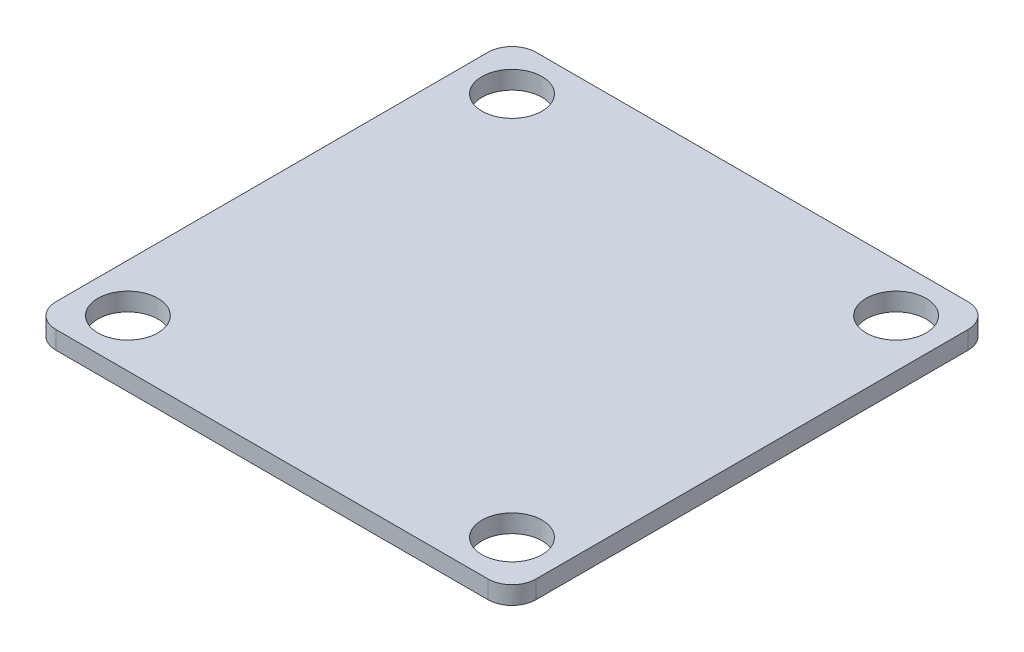
ISO-10303-21;
HEADER;
FILE_DESCRIPTION(('STEP AP214'),'2;1');
FILE_NAME('part.step','',(''),(''),'','','');
FILE_SCHEMA(('AUTOMOTIVE_DESIGN { 1 0 10303 214 1 1 1 1 }'));
ENDSEC;
DATA;
#1=APPLICATION_CONTEXT('core data for automotive mechanical design processes');
#2=APPLICATION_PROTOCOL_DEFINITION('international standard','automotive_design',2000,#1);
#3=PRODUCT_CONTEXT('',#1,'mechanical');
#4=PRODUCT('Part','Part','',(#3));
#5=PRODUCT_RELATED_PRODUCT_CATEGORY('part','',(#4));
#6=PRODUCT_DEFINITION_FORMATION('','',#4);
#7=PRODUCT_DEFINITION_CONTEXT('part definition',#1,'design');
#8=PRODUCT_DEFINITION('design','',#6,#7);
#9=PRODUCT_DEFINITION_SHAPE('','',#8);
#10=(LENGTH_UNIT() NAMED_UNIT(*) SI_UNIT(.MILLI.,.METRE.));
#11=(NAMED_UNIT(*) PLANE_ANGLE_UNIT() SI_UNIT($,.RADIAN.));
#12=(NAMED_UNIT(*) SI_UNIT($,.STERADIAN.) SOLID_ANGLE_UNIT());
#13=UNCERTAINTY_MEASURE_WITH_UNIT(LENGTH_MEASURE(1.E-05),#10,'distance_accuracy_value','');
#14=(GEOMETRIC_REPRESENTATION_CONTEXT(3) GLOBAL_UNCERTAINTY_ASSIGNED_CONTEXT((#13)) GLOBAL_UNIT_ASSIGNED_CONTEXT((#10,
#11,#12)) REPRESENTATION_CONTEXT('',''));
#15=CARTESIAN_POINT('',(0.,0.,0.));
#16=DIRECTION('',(0.,0.,1.));
#17=DIRECTION('',(1.,0.,0.));
#18=AXIS2_PLACEMENT_3D('',#15,#16,#17);
#19=CARTESIAN_POINT('',(36.,3.,-36.));
#20=DIRECTION('',(0.,-1.,0.));
#21=DIRECTION('',(0.,0.,-1.));
#22=AXIS2_PLACEMENT_3D('',#19,#20,#21);
#23=CYLINDRICAL_SURFACE('',#22,4.);
#24=CARTESIAN_POINT('',(36.,0.,-36.));
#25=DIRECTION('',(0.,1.,0.));
#26=DIRECTION('',(0.,0.,-1.));
#27=AXIS2_PLACEMENT_3D('',#24,#25,#26);
#28=CIRCLE('',#27,4.);
#29=CARTESIAN_POINT('',(40.,0.,-36.));
#30=VERTEX_POINT('',#29);
#31=CARTESIAN_POINT('',(36.,0.,-40.));
#32=VERTEX_POINT('',#31);
#33=EDGE_CURVE('E128',#30,#32,#28,.T.);
#34=ORIENTED_EDGE('',*,*,#33,.T.);
#35=DIRECTION('',(0.,-1.,0.));
#36=VECTOR('',#35,1.);
#37=CARTESIAN_POINT('',(36.,3.,-40.));
#38=LINE('',#37,#36);
#39=CARTESIAN_POINT('',(36.,3.,-40.));
#40=VERTEX_POINT('',#39);
#41=EDGE_CURVE('E11',#40,#32,#38,.T.);
#42=ORIENTED_EDGE('',*,*,#41,.F.);
#43=CARTESIAN_POINT('',(36.,3.,-36.));
#44=DIRECTION('',(0.,1.,0.));
#45=DIRECTION('',(0.,0.,-1.));
#46=AXIS2_PLACEMENT_3D('',#43,#44,#45);
#47=CIRCLE('',#46,4.);
#48=CARTESIAN_POINT('',(40.,3.,-36.));
#49=VERTEX_POINT('',#48);
#50=EDGE_CURVE('E143',#49,#40,#47,.T.);
#51=ORIENTED_EDGE('',*,*,#50,.F.);
#52=DIRECTION('',(0.,-1.,0.));
#53=VECTOR('',#52,1.);
#54=CARTESIAN_POINT('',(40.,3.,-36.));
#55=LINE('',#54,#53);
#56=EDGE_CURVE('E124',#49,#30,#55,.T.);
#57=ORIENTED_EDGE('',*,*,#56,.T.);
#58=EDGE_LOOP('',(#34,#42,#51,#57));
#59=FACE_BOUND('',#58,.T.);
#60=ADVANCED_FACE('F32',(#59),#23,.T.);
#61=CARTESIAN_POINT('',(-36.,3.,-40.));
#62=DIRECTION('',(0.,0.,1.));
#63=DIRECTION('',(1.,0.,0.));
#64=AXIS2_PLACEMENT_3D('',#61,#62,#63);
#65=PLANE('',#64);
#66=DIRECTION('',(-1.,0.,0.));
#67=VECTOR('',#66,1.);
#68=CARTESIAN_POINT('',(-36.,0.,-40.));
#69=LINE('',#68,#67);
#70=CARTESIAN_POINT('',(-36.,0.,-40.));
#71=VERTEX_POINT('',#70);
#72=EDGE_CURVE('E131',#32,#71,#69,.T.);
#73=ORIENTED_EDGE('',*,*,#72,.T.);
#74=DIRECTION('',(0.,-1.,0.));
#75=VECTOR('',#74,1.);
#76=CARTESIAN_POINT('',(-36.,3.,-40.));
#77=LINE('',#76,#75);
#78=CARTESIAN_POINT('',(-36.,3.,-40.));
#79=VERTEX_POINT('',#78);
#80=EDGE_CURVE('E40',#79,#71,#77,.T.);
#81=ORIENTED_EDGE('',*,*,#80,.F.);
#82=DIRECTION('',(-1.,0.,0.));
#83=VECTOR('',#82,1.);
#84=CARTESIAN_POINT('',(-36.,3.,-40.));
#85=LINE('',#84,#83);
#86=EDGE_CURVE('E91',#40,#79,#85,.T.);
#87=ORIENTED_EDGE('',*,*,#86,.F.);
#88=ORIENTED_EDGE('',*,*,#41,.T.);
#89=EDGE_LOOP('',(#73,#81,#87,#88));
#90=FACE_BOUND('',#89,.T.);
#91=ADVANCED_FACE('F233',(#90),#65,.F.);
#92=CARTESIAN_POINT('',(-36.,3.,-36.));
#93=DIRECTION('',(0.,-1.,0.));
#94=DIRECTION('',(0.,0.,-1.));
#95=AXIS2_PLACEMENT_3D('',#92,#93,#94);
#96=CYLINDRICAL_SURFACE('',#95,4.);
#97=CARTESIAN_POINT('',(-36.,0.,-36.));
#98=DIRECTION('',(0.,1.,0.));
#99=DIRECTION('',(0.,0.,1.));
#100=AXIS2_PLACEMENT_3D('',#97,#98,#99);
#101=CIRCLE('',#100,4.);
#102=CARTESIAN_POINT('',(-40.,0.,-36.));
#103=VERTEX_POINT('',#102);
#104=EDGE_CURVE('E134',#71,#103,#101,.T.);
#105=ORIENTED_EDGE('',*,*,#104,.T.);
#106=DIRECTION('',(0.,-1.,0.));
#107=VECTOR('',#106,1.);
#108=CARTESIAN_POINT('',(-40.,3.,-36.));
#109=LINE('',#108,#107);
#110=CARTESIAN_POINT('',(-40.,3.,-36.));
#111=VERTEX_POINT('',#110);
#112=EDGE_CURVE('E150',#111,#103,#109,.T.);
#113=ORIENTED_EDGE('',*,*,#112,.F.);
#114=CARTESIAN_POINT('',(-36.,3.,-36.));
#115=DIRECTION('',(0.,1.,0.));
#116=DIRECTION('',(0.,0.,1.));
#117=AXIS2_PLACEMENT_3D('',#114,#115,#116);
#118=CIRCLE('',#117,4.);
#119=EDGE_CURVE('E158',#79,#111,#118,.T.);
#120=ORIENTED_EDGE('',*,*,#119,.F.);
#121=ORIENTED_EDGE('',*,*,#80,.T.);
#122=EDGE_LOOP('',(#105,#113,#120,#121));
#123=FACE_BOUND('',#122,.T.);
#124=ADVANCED_FACE('F156',(#123),#96,.T.);
#125=CARTESIAN_POINT('',(-40.,3.,-36.));
#126=DIRECTION('',(1.,0.,0.));
#127=DIRECTION('',(0.,0.,-1.));
#128=AXIS2_PLACEMENT_3D('',#125,#126,#127);
#129=PLANE('',#128);
#130=DIRECTION('',(0.,0.,1.));
#131=VECTOR('',#130,1.);
#132=CARTESIAN_POINT('',(-40.,0.,-36.));
#133=LINE('',#132,#131);
#134=CARTESIAN_POINT('',(-40.,0.,36.));
#135=VERTEX_POINT('',#134);
#136=EDGE_CURVE('E136',#103,#135,#133,.T.);
#137=ORIENTED_EDGE('',*,*,#136,.T.);
#138=DIRECTION('',(0.,-1.,0.));
#139=VECTOR('',#138,1.);
#140=CARTESIAN_POINT('',(-40.,3.,36.));
#141=LINE('',#140,#139);
#142=CARTESIAN_POINT('',(-40.,3.,36.));
#143=VERTEX_POINT('',#142);
#144=EDGE_CURVE('E147',#143,#135,#141,.T.);
#145=ORIENTED_EDGE('',*,*,#144,.F.);
#146=DIRECTION('',(0.,0.,1.));
#147=VECTOR('',#146,1.);
#148=CARTESIAN_POINT('',(-40.,3.,-36.));
#149=LINE('',#148,#147);
#150=EDGE_CURVE('E170',#111,#143,#149,.T.);
#151=ORIENTED_EDGE('',*,*,#150,.F.);
#152=ORIENTED_EDGE('',*,*,#112,.T.);
#153=EDGE_LOOP('',(#137,#145,#151,#152));
#154=FACE_BOUND('',#153,.T.);
#155=ADVANCED_FACE('F166',(#154),#129,.F.);
#156=CARTESIAN_POINT('',(-36.,3.,36.));
#157=DIRECTION('',(0.,-1.,0.));
#158=DIRECTION('',(0.,0.,-1.));
#159=AXIS2_PLACEMENT_3D('',#156,#157,#158);
#160=CYLINDRICAL_SURFACE('',#159,4.);
#161=CARTESIAN_POINT('',(-36.,0.,36.));
#162=DIRECTION('',(0.,1.,0.));
#163=DIRECTION('',(0.,0.,1.));
#164=AXIS2_PLACEMENT_3D('',#161,#162,#163);
#165=CIRCLE('',#164,4.);
#166=CARTESIAN_POINT('',(-36.,0.,40.));
#167=VERTEX_POINT('',#166);
#168=EDGE_CURVE('E138',#135,#167,#165,.T.);
#169=ORIENTED_EDGE('',*,*,#168,.T.);
#170=DIRECTION('',(0.,-1.,0.));
#171=VECTOR('',#170,1.);
#172=CARTESIAN_POINT('',(-36.,3.,40.));
#173=LINE('',#172,#171);
#174=CARTESIAN_POINT('',(-36.,3.,40.));
#175=VERTEX_POINT('',#174);
#176=EDGE_CURVE('E119',#175,#167,#173,.T.);
#177=ORIENTED_EDGE('',*,*,#176,.F.);
#178=CARTESIAN_POINT('',(-36.,3.,36.));
#179=DIRECTION('',(0.,1.,0.));
#180=DIRECTION('',(0.,0.,1.));
#181=AXIS2_PLACEMENT_3D('',#178,#179,#180);
#182=CIRCLE('',#181,4.);
#183=EDGE_CURVE('E110',#143,#175,#182,.T.);
#184=ORIENTED_EDGE('',*,*,#183,.F.);
#185=ORIENTED_EDGE('',*,*,#144,.T.);
#186=EDGE_LOOP('',(#169,#177,#184,#185));
#187=FACE_BOUND('',#186,.T.);
#188=ADVANCED_FACE('F169',(#187),#160,.T.);
#189=CARTESIAN_POINT('',(-36.,3.,40.));
#190=DIRECTION('',(0.,0.,-1.));
#191=DIRECTION('',(-1.,0.,0.));
#192=AXIS2_PLACEMENT_3D('',#189,#190,#191);
#193=PLANE('',#192);
#194=DIRECTION('',(1.,0.,0.));
#195=VECTOR('',#194,1.);
#196=CARTESIAN_POINT('',(-36.,0.,40.));
#197=LINE('',#196,#195);
#198=CARTESIAN_POINT('',(36.,0.,40.));
#199=VERTEX_POINT('',#198);
#200=EDGE_CURVE('E118',#167,#199,#197,.T.);
#201=ORIENTED_EDGE('',*,*,#200,.T.);
#202=DIRECTION('',(0.,-1.,0.));
#203=VECTOR('',#202,1.);
#204=CARTESIAN_POINT('',(36.,3.,40.));
#205=LINE('',#204,#203);
#206=CARTESIAN_POINT('',(36.,3.,40.));
#207=VERTEX_POINT('',#206);
#208=EDGE_CURVE('E115',#207,#199,#205,.T.);
#209=ORIENTED_EDGE('',*,*,#208,.F.);
#210=DIRECTION('',(1.,0.,0.));
#211=VECTOR('',#210,1.);
#212=CARTESIAN_POINT('',(-36.,3.,40.));
#213=LINE('',#212,#211);
#214=EDGE_CURVE('E104',#175,#207,#213,.T.);
#215=ORIENTED_EDGE('',*,*,#214,.F.);
#216=ORIENTED_EDGE('',*,*,#176,.T.);
#217=EDGE_LOOP('',(#201,#209,#215,#216));
#218=FACE_BOUND('',#217,.T.);
#219=ADVANCED_FACE('F116',(#218),#193,.F.);
#220=CARTESIAN_POINT('',(36.,3.,36.));
#221=DIRECTION('',(0.,-1.,0.));
#222=DIRECTION('',(0.,0.,-1.));
#223=AXIS2_PLACEMENT_3D('',#220,#221,#222);
#224=CYLINDRICAL_SURFACE('',#223,4.);
#225=CARTESIAN_POINT('',(36.,0.,36.));
#226=DIRECTION('',(0.,1.,0.));
#227=DIRECTION('',(0.,0.,1.));
#228=AXIS2_PLACEMENT_3D('',#225,#226,#227);
#229=CIRCLE('',#228,4.);
#230=CARTESIAN_POINT('',(40.,0.,36.));
#231=VERTEX_POINT('',#230);
#232=EDGE_CURVE('E77',#199,#231,#229,.T.);
#233=ORIENTED_EDGE('',*,*,#232,.T.);
#234=DIRECTION('',(0.,-1.,0.));
#235=VECTOR('',#234,1.);
#236=CARTESIAN_POINT('',(40.,3.,36.));
#237=LINE('',#236,#235);
#238=CARTESIAN_POINT('',(40.,3.,36.));
#239=VERTEX_POINT('',#238);
#240=EDGE_CURVE('E120',#239,#231,#237,.T.);
#241=ORIENTED_EDGE('',*,*,#240,.F.);
#242=CARTESIAN_POINT('',(36.,3.,36.));
#243=DIRECTION('',(0.,1.,0.));
#244=DIRECTION('',(0.,0.,1.));
#245=AXIS2_PLACEMENT_3D('',#242,#243,#244);
#246=CIRCLE('',#245,4.);
#247=EDGE_CURVE('E108',#207,#239,#246,.T.);
#248=ORIENTED_EDGE('',*,*,#247,.F.);
#249=ORIENTED_EDGE('',*,*,#208,.T.);
#250=EDGE_LOOP('',(#233,#241,#248,#249));
#251=FACE_BOUND('',#250,.T.);
#252=ADVANCED_FACE('F122',(#251),#224,.T.);
#253=CARTESIAN_POINT('',(40.,3.,-36.));
#254=DIRECTION('',(-1.,0.,0.));
#255=DIRECTION('',(0.,0.,1.));
#256=AXIS2_PLACEMENT_3D('',#253,#254,#255);
#257=PLANE('',#256);
#258=DIRECTION('',(0.,0.,-1.));
#259=VECTOR('',#258,1.);
#260=CARTESIAN_POINT('',(40.,0.,-36.));
#261=LINE('',#260,#259);
#262=EDGE_CURVE('E83',#231,#30,#261,.T.);
#263=ORIENTED_EDGE('',*,*,#262,.T.);
#264=ORIENTED_EDGE('',*,*,#56,.F.);
#265=DIRECTION('',(0.,0.,-1.));
#266=VECTOR('',#265,1.);
#267=CARTESIAN_POINT('',(40.,3.,-36.));
#268=LINE('',#267,#266);
#269=EDGE_CURVE('E48',#239,#49,#268,.T.);
#270=ORIENTED_EDGE('',*,*,#269,.F.);
#271=ORIENTED_EDGE('',*,*,#240,.T.);
#272=EDGE_LOOP('',(#263,#264,#270,#271));
#273=FACE_BOUND('',#272,.T.);
#274=ADVANCED_FACE('F211',(#273),#257,.F.);
#275=CARTESIAN_POINT('',(36.,3.,-36.));
#276=DIRECTION('',(0.,-1.,0.));
#277=DIRECTION('',(0.,0.,-1.));
#278=AXIS2_PLACEMENT_3D('',#275,#276,#277);
#279=PLANE('',#278);
#280=CARTESIAN_POINT('',(32.,3.,-32.000000000002));
#281=DIRECTION('',(0.,1.,0.));
#282=DIRECTION('',(0.,0.,1.));
#283=AXIS2_PLACEMENT_3D('',#280,#281,#282);
#284=CIRCLE('',#283,5.);
#285=CARTESIAN_POINT('',(32.,3.,-27.000000000002));
#286=VERTEX_POINT('',#285);
#287=EDGE_CURVE('E194',#286,#286,#284,.T.);
#288=ORIENTED_EDGE('',*,*,#287,.F.);
#289=EDGE_LOOP('',(#288));
#290=FACE_BOUND('',#289,.T.);
#291=CARTESIAN_POINT('',(32.000000000002,3.,31.999999999998));
#292=DIRECTION('',(0.,1.,0.));
#293=DIRECTION('',(0.,0.,1.));
#294=AXIS2_PLACEMENT_3D('',#291,#292,#293);
#295=CIRCLE('',#294,5.);
#296=CARTESIAN_POINT('',(32.000000000002,3.,36.999999999998));
#297=VERTEX_POINT('',#296);
#298=EDGE_CURVE('E188',#297,#297,#295,.T.);
#299=ORIENTED_EDGE('',*,*,#298,.F.);
#300=EDGE_LOOP('',(#299));
#301=FACE_BOUND('',#300,.T.);
#302=CARTESIAN_POINT('',(-31.999999999998,3.,32.));
#303=DIRECTION('',(0.,1.,0.));
#304=DIRECTION('',(0.,0.,1.));
#305=AXIS2_PLACEMENT_3D('',#302,#303,#304);
#306=CIRCLE('',#305,5.);
#307=CARTESIAN_POINT('',(-31.999999999998,3.,37.));
#308=VERTEX_POINT('',#307);
#309=EDGE_CURVE('E182',#308,#308,#306,.T.);
#310=ORIENTED_EDGE('',*,*,#309,.F.);
#311=EDGE_LOOP('',(#310));
#312=FACE_BOUND('',#311,.T.);
#313=CARTESIAN_POINT('',(-32.,3.,-32.));
#314=DIRECTION('',(0.,1.,0.));
#315=DIRECTION('',(0.,0.,1.));
#316=AXIS2_PLACEMENT_3D('',#313,#314,#315);
#317=CIRCLE('',#316,5.);
#318=CARTESIAN_POINT('',(-32.,3.,-27.));
#319=VERTEX_POINT('',#318);
#320=EDGE_CURVE('E176',#319,#319,#317,.T.);
#321=ORIENTED_EDGE('',*,*,#320,.F.);
#322=EDGE_LOOP('',(#321));
#323=FACE_BOUND('',#322,.T.);
#324=ORIENTED_EDGE('',*,*,#50,.T.);
#325=ORIENTED_EDGE('',*,*,#86,.T.);
#326=ORIENTED_EDGE('',*,*,#119,.T.);
#327=ORIENTED_EDGE('',*,*,#150,.T.);
#328=ORIENTED_EDGE('',*,*,#183,.T.);
#329=ORIENTED_EDGE('',*,*,#214,.T.);
#330=ORIENTED_EDGE('',*,*,#247,.T.);
#331=ORIENTED_EDGE('',*,*,#269,.T.);
#332=EDGE_LOOP('',(#324,#325,#326,#327,#328,#329,#330,#331));
#333=FACE_BOUND('',#332,.T.);
#334=ADVANCED_FACE('F106',(#290,#301,#312,#323,#333),#279,.F.);
#335=CARTESIAN_POINT('',(36.,0.,-36.));
#336=DIRECTION('',(0.,-1.,0.));
#337=DIRECTION('',(0.,0.,-1.));
#338=AXIS2_PLACEMENT_3D('',#335,#336,#337);
#339=PLANE('',#338);
#340=CARTESIAN_POINT('',(32.,0.,-32.000000000002));
#341=DIRECTION('',(0.,1.,0.));
#342=DIRECTION('',(0.,0.,1.));
#343=AXIS2_PLACEMENT_3D('',#340,#341,#342);
#344=CIRCLE('',#343,5.);
#345=CARTESIAN_POINT('',(32.,0.,-27.000000000002));
#346=VERTEX_POINT('',#345);
#347=EDGE_CURVE('E179',#346,#346,#344,.T.);
#348=ORIENTED_EDGE('',*,*,#347,.T.);
#349=EDGE_LOOP('',(#348));
#350=FACE_BOUND('',#349,.T.);
#351=CARTESIAN_POINT('',(32.000000000002,0.,31.999999999998));
#352=DIRECTION('',(0.,1.,0.));
#353=DIRECTION('',(0.,0.,1.));
#354=AXIS2_PLACEMENT_3D('',#351,#352,#353);
#355=CIRCLE('',#354,5.);
#356=CARTESIAN_POINT('',(32.000000000002,0.,36.999999999998));
#357=VERTEX_POINT('',#356);
#358=EDGE_CURVE('E191',#357,#357,#355,.T.);
#359=ORIENTED_EDGE('',*,*,#358,.T.);
#360=EDGE_LOOP('',(#359));
#361=FACE_BOUND('',#360,.T.);
#362=CARTESIAN_POINT('',(-31.999999999998,0.,32.));
#363=DIRECTION('',(0.,1.,0.));
#364=DIRECTION('',(0.,0.,1.));
#365=AXIS2_PLACEMENT_3D('',#362,#363,#364);
#366=CIRCLE('',#365,5.);
#367=CARTESIAN_POINT('',(-31.999999999998,0.,37.));
#368=VERTEX_POINT('',#367);
#369=EDGE_CURVE('E185',#368,#368,#366,.T.);
#370=ORIENTED_EDGE('',*,*,#369,.T.);
#371=EDGE_LOOP('',(#370));
#372=FACE_BOUND('',#371,.T.);
#373=CARTESIAN_POINT('',(-32.,0.,-32.));
#374=DIRECTION('',(0.,1.,0.));
#375=DIRECTION('',(0.,0.,1.));
#376=AXIS2_PLACEMENT_3D('',#373,#374,#375);
#377=CIRCLE('',#376,5.);
#378=CARTESIAN_POINT('',(-32.,0.,-27.));
#379=VERTEX_POINT('',#378);
#380=EDGE_CURVE('E132',#379,#379,#377,.T.);
#381=ORIENTED_EDGE('',*,*,#380,.T.);
#382=EDGE_LOOP('',(#381));
#383=FACE_BOUND('',#382,.T.);
#384=ORIENTED_EDGE('',*,*,#33,.F.);
#385=ORIENTED_EDGE('',*,*,#262,.F.);
#386=ORIENTED_EDGE('',*,*,#232,.F.);
#387=ORIENTED_EDGE('',*,*,#200,.F.);
#388=ORIENTED_EDGE('',*,*,#168,.F.);
#389=ORIENTED_EDGE('',*,*,#136,.F.);
#390=ORIENTED_EDGE('',*,*,#104,.F.);
#391=ORIENTED_EDGE('',*,*,#72,.F.);
#392=EDGE_LOOP('',(#384,#385,#386,#387,#388,#389,#390,#391));
#393=FACE_BOUND('',#392,.T.);
#394=ADVANCED_FACE('F162',(#350,#361,#372,#383,#393),#339,.T.);
#395=CARTESIAN_POINT('',(-32.,0.,-32.));
#396=DIRECTION('',(0.,1.,0.));
#397=DIRECTION('',(0.,0.,1.));
#398=AXIS2_PLACEMENT_3D('',#395,#396,#397);
#399=CYLINDRICAL_SURFACE('',#398,5.);
#400=ORIENTED_EDGE('',*,*,#380,.F.);
#401=EDGE_LOOP('',(#400));
#402=FACE_BOUND('',#401,.T.);
#403=ORIENTED_EDGE('',*,*,#320,.T.);
#404=EDGE_LOOP('',(#403));
#405=FACE_BOUND('',#404,.T.);
#406=ADVANCED_FACE('F219',(#402,#405),#399,.F.);
#407=CARTESIAN_POINT('',(-31.999999999998,0.,32.));
#408=DIRECTION('',(0.,1.,0.));
#409=DIRECTION('',(0.,0.,1.));
#410=AXIS2_PLACEMENT_3D('',#407,#408,#409);
#411=CYLINDRICAL_SURFACE('',#410,5.);
#412=ORIENTED_EDGE('',*,*,#369,.F.);
#413=EDGE_LOOP('',(#412));
#414=FACE_BOUND('',#413,.T.);
#415=ORIENTED_EDGE('',*,*,#309,.T.);
#416=EDGE_LOOP('',(#415));
#417=FACE_BOUND('',#416,.T.);
#418=ADVANCED_FACE('F221',(#414,#417),#411,.F.);
#419=CARTESIAN_POINT('',(32.000000000002,0.,31.999999999998));
#420=DIRECTION('',(0.,1.,0.));
#421=DIRECTION('',(0.,0.,1.));
#422=AXIS2_PLACEMENT_3D('',#419,#420,#421);
#423=CYLINDRICAL_SURFACE('',#422,5.);
#424=ORIENTED_EDGE('',*,*,#358,.F.);
#425=EDGE_LOOP('',(#424));
#426=FACE_BOUND('',#425,.T.);
#427=ORIENTED_EDGE('',*,*,#298,.T.);
#428=EDGE_LOOP('',(#427));
#429=FACE_BOUND('',#428,.T.);
#430=ADVANCED_FACE('F205',(#426,#429),#423,.F.);
#431=CARTESIAN_POINT('',(32.,0.,-32.000000000002));
#432=DIRECTION('',(0.,1.,0.));
#433=DIRECTION('',(0.,0.,1.));
#434=AXIS2_PLACEMENT_3D('',#431,#432,#433);
#435=CYLINDRICAL_SURFACE('',#434,5.);
#436=ORIENTED_EDGE('',*,*,#347,.F.);
#437=EDGE_LOOP('',(#436));
#438=FACE_BOUND('',#437,.T.);
#439=ORIENTED_EDGE('',*,*,#287,.T.);
#440=EDGE_LOOP('',(#439));
#441=FACE_BOUND('',#440,.T.);
#442=ADVANCED_FACE('F202',(#438,#441),#435,.F.);
#443=CLOSED_SHELL('',(#60,#91,#124,#155,#188,#219,#252,#274,#334,#394,#406,#418,#430,#442));
#444=MANIFOLD_SOLID_BREP('B2',#443);
#445=ADVANCED_BREP_SHAPE_REPRESENTATION('',(#18,#444),#14);
#446=SHAPE_DEFINITION_REPRESENTATION(#9,#445);
ENDSEC;
END-ISO-10303-21;
